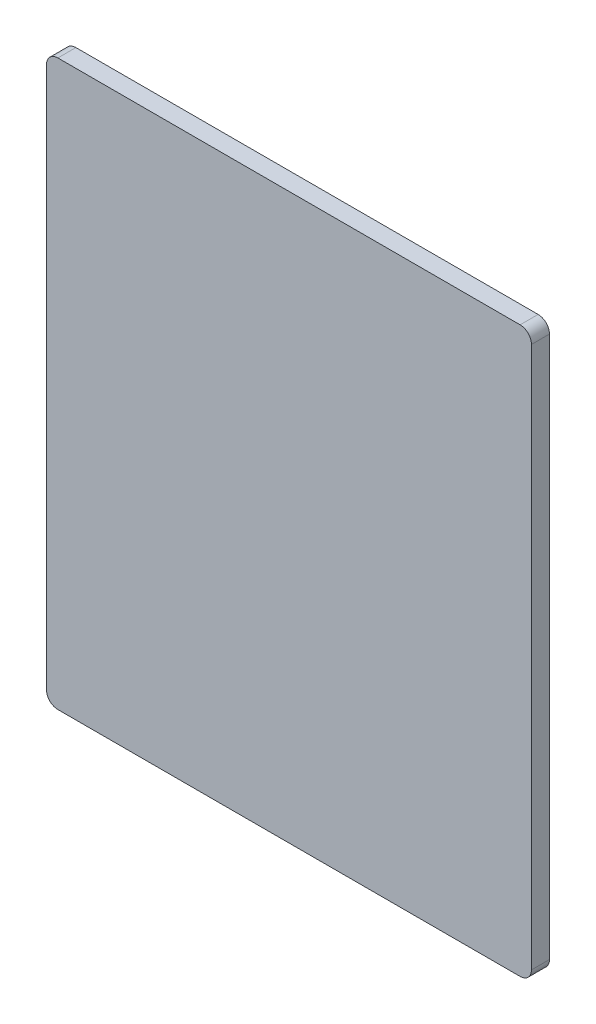
ISO-10303-21;
HEADER;
FILE_DESCRIPTION(('STEP AP214'),'2;1');
FILE_NAME('part.step','',(''),(''),'','','');
FILE_SCHEMA(('AUTOMOTIVE_DESIGN { 1 0 10303 214 1 1 1 1 }'));
ENDSEC;
DATA;
#1=APPLICATION_CONTEXT('core data for automotive mechanical design processes');
#2=APPLICATION_PROTOCOL_DEFINITION('international standard','automotive_design',2000,#1);
#3=PRODUCT_CONTEXT('',#1,'mechanical');
#4=PRODUCT('Part','Part','',(#3));
#5=PRODUCT_RELATED_PRODUCT_CATEGORY('part','',(#4));
#6=PRODUCT_DEFINITION_FORMATION('','',#4);
#7=PRODUCT_DEFINITION_CONTEXT('part definition',#1,'design');
#8=PRODUCT_DEFINITION('design','',#6,#7);
#9=PRODUCT_DEFINITION_SHAPE('','',#8);
#10=(LENGTH_UNIT() NAMED_UNIT(*) SI_UNIT(.MILLI.,.METRE.));
#11=(NAMED_UNIT(*) PLANE_ANGLE_UNIT() SI_UNIT($,.RADIAN.));
#12=(NAMED_UNIT(*) SI_UNIT($,.STERADIAN.) SOLID_ANGLE_UNIT());
#13=UNCERTAINTY_MEASURE_WITH_UNIT(LENGTH_MEASURE(1.E-05),#10,'distance_accuracy_value','');
#14=(GEOMETRIC_REPRESENTATION_CONTEXT(3) GLOBAL_UNCERTAINTY_ASSIGNED_CONTEXT((#13)) GLOBAL_UNIT_ASSIGNED_CONTEXT((#10,
#11,#12)) REPRESENTATION_CONTEXT('',''));
#15=CARTESIAN_POINT('',(0.,0.,0.));
#16=DIRECTION('',(0.,0.,1.));
#17=DIRECTION('',(1.,0.,0.));
#18=AXIS2_PLACEMENT_3D('',#15,#16,#17);
#19=CARTESIAN_POINT('',(40.75,-97.5,3.175));
#20=DIRECTION('',(0.,0.,-1.));
#21=DIRECTION('',(-1.,0.,0.));
#22=AXIS2_PLACEMENT_3D('',#19,#20,#21);
#23=CYLINDRICAL_SURFACE('',#22,1.99999999999999);
#24=CARTESIAN_POINT('',(40.75,-97.5,0.));
#25=DIRECTION('',(0.,0.,1.));
#26=DIRECTION('',(1.,0.,0.));
#27=AXIS2_PLACEMENT_3D('',#24,#25,#26);
#28=CIRCLE('',#27,1.99999999999999);
#29=CARTESIAN_POINT('',(40.75,-99.5,0.));
#30=VERTEX_POINT('',#29);
#31=CARTESIAN_POINT('',(42.75,-97.5,0.));
#32=VERTEX_POINT('',#31);
#33=EDGE_CURVE('E128',#30,#32,#28,.T.);
#34=ORIENTED_EDGE('',*,*,#33,.T.);
#35=DIRECTION('',(0.,0.,-1.));
#36=VECTOR('',#35,1.);
#37=CARTESIAN_POINT('',(42.75,-97.5,3.175));
#38=LINE('',#37,#36);
#39=CARTESIAN_POINT('',(42.75,-97.5,3.175));
#40=VERTEX_POINT('',#39);
#41=EDGE_CURVE('E11',#40,#32,#38,.T.);
#42=ORIENTED_EDGE('',*,*,#41,.F.);
#43=CARTESIAN_POINT('',(40.75,-97.5,3.175));
#44=DIRECTION('',(0.,0.,1.));
#45=DIRECTION('',(1.,0.,0.));
#46=AXIS2_PLACEMENT_3D('',#43,#44,#45);
#47=CIRCLE('',#46,1.99999999999999);
#48=CARTESIAN_POINT('',(40.75,-99.5,3.175));
#49=VERTEX_POINT('',#48);
#50=EDGE_CURVE('E142',#49,#40,#47,.T.);
#51=ORIENTED_EDGE('',*,*,#50,.F.);
#52=DIRECTION('',(0.,0.,-1.));
#53=VECTOR('',#52,1.);
#54=CARTESIAN_POINT('',(40.75,-99.5,3.175));
#55=LINE('',#54,#53);
#56=EDGE_CURVE('E124',#49,#30,#55,.T.);
#57=ORIENTED_EDGE('',*,*,#56,.T.);
#58=EDGE_LOOP('',(#34,#42,#51,#57));
#59=FACE_BOUND('',#58,.T.);
#60=ADVANCED_FACE('F32',(#59),#23,.T.);
#61=CARTESIAN_POINT('',(42.75,-2.,3.175));
#62=DIRECTION('',(-1.,0.,0.));
#63=DIRECTION('',(0.,-1.,0.));
#64=AXIS2_PLACEMENT_3D('',#61,#62,#63);
#65=PLANE('',#64);
#66=DIRECTION('',(0.,1.,0.));
#67=VECTOR('',#66,1.);
#68=CARTESIAN_POINT('',(42.75,-2.,0.));
#69=LINE('',#68,#67);
#70=CARTESIAN_POINT('',(42.75,-2.,0.));
#71=VERTEX_POINT('',#70);
#72=EDGE_CURVE('E131',#32,#71,#69,.T.);
#73=ORIENTED_EDGE('',*,*,#72,.T.);
#74=DIRECTION('',(0.,0.,-1.));
#75=VECTOR('',#74,1.);
#76=CARTESIAN_POINT('',(42.75,-2.,3.175));
#77=LINE('',#76,#75);
#78=CARTESIAN_POINT('',(42.75,-2.,3.175));
#79=VERTEX_POINT('',#78);
#80=EDGE_CURVE('E40',#79,#71,#77,.T.);
#81=ORIENTED_EDGE('',*,*,#80,.F.);
#82=DIRECTION('',(0.,1.,0.));
#83=VECTOR('',#82,1.);
#84=CARTESIAN_POINT('',(42.75,-2.,3.175));
#85=LINE('',#84,#83);
#86=EDGE_CURVE('E91',#40,#79,#85,.T.);
#87=ORIENTED_EDGE('',*,*,#86,.F.);
#88=ORIENTED_EDGE('',*,*,#41,.T.);
#89=EDGE_LOOP('',(#73,#81,#87,#88));
#90=FACE_BOUND('',#89,.T.);
#91=ADVANCED_FACE('F177',(#90),#65,.F.);
#92=CARTESIAN_POINT('',(40.75,-2.,3.175));
#93=DIRECTION('',(0.,0.,-1.));
#94=DIRECTION('',(-1.,0.,0.));
#95=AXIS2_PLACEMENT_3D('',#92,#93,#94);
#96=CYLINDRICAL_SURFACE('',#95,2.);
#97=CARTESIAN_POINT('',(40.75,-2.,0.));
#98=DIRECTION('',(0.,0.,1.));
#99=DIRECTION('',(-1.,0.,0.));
#100=AXIS2_PLACEMENT_3D('',#97,#98,#99);
#101=CIRCLE('',#100,2.);
#102=CARTESIAN_POINT('',(40.75,0.,0.));
#103=VERTEX_POINT('',#102);
#104=EDGE_CURVE('E133',#71,#103,#101,.T.);
#105=ORIENTED_EDGE('',*,*,#104,.T.);
#106=DIRECTION('',(0.,0.,-1.));
#107=VECTOR('',#106,1.);
#108=CARTESIAN_POINT('',(40.75,0.,3.175));
#109=LINE('',#108,#107);
#110=CARTESIAN_POINT('',(40.75,0.,3.175));
#111=VERTEX_POINT('',#110);
#112=EDGE_CURVE('E149',#111,#103,#109,.T.);
#113=ORIENTED_EDGE('',*,*,#112,.F.);
#114=CARTESIAN_POINT('',(40.75,-2.,3.175));
#115=DIRECTION('',(0.,0.,1.));
#116=DIRECTION('',(-1.,0.,0.));
#117=AXIS2_PLACEMENT_3D('',#114,#115,#116);
#118=CIRCLE('',#117,2.);
#119=EDGE_CURVE('E157',#79,#111,#118,.T.);
#120=ORIENTED_EDGE('',*,*,#119,.F.);
#121=ORIENTED_EDGE('',*,*,#80,.T.);
#122=EDGE_LOOP('',(#105,#113,#120,#121));
#123=FACE_BOUND('',#122,.T.);
#124=ADVANCED_FACE('F155',(#123),#96,.T.);
#125=CARTESIAN_POINT('',(-40.75,0.,3.175));
#126=DIRECTION('',(0.,-1.,0.));
#127=DIRECTION('',(0.,0.,-1.));
#128=AXIS2_PLACEMENT_3D('',#125,#126,#127);
#129=PLANE('',#128);
#130=DIRECTION('',(-1.,0.,0.));
#131=VECTOR('',#130,1.);
#132=CARTESIAN_POINT('',(-40.75,0.,0.));
#133=LINE('',#132,#131);
#134=CARTESIAN_POINT('',(-40.75,0.,0.));
#135=VERTEX_POINT('',#134);
#136=EDGE_CURVE('E135',#103,#135,#133,.T.);
#137=ORIENTED_EDGE('',*,*,#136,.T.);
#138=DIRECTION('',(0.,0.,-1.));
#139=VECTOR('',#138,1.);
#140=CARTESIAN_POINT('',(-40.75,0.,3.175));
#141=LINE('',#140,#139);
#142=CARTESIAN_POINT('',(-40.75,0.,3.175));
#143=VERTEX_POINT('',#142);
#144=EDGE_CURVE('E146',#143,#135,#141,.T.);
#145=ORIENTED_EDGE('',*,*,#144,.F.);
#146=DIRECTION('',(-1.,0.,0.));
#147=VECTOR('',#146,1.);
#148=CARTESIAN_POINT('',(-40.75,0.,3.175));
#149=LINE('',#148,#147);
#150=EDGE_CURVE('E169',#111,#143,#149,.T.);
#151=ORIENTED_EDGE('',*,*,#150,.F.);
#152=ORIENTED_EDGE('',*,*,#112,.T.);
#153=EDGE_LOOP('',(#137,#145,#151,#152));
#154=FACE_BOUND('',#153,.T.);
#155=ADVANCED_FACE('F165',(#154),#129,.F.);
#156=CARTESIAN_POINT('',(-40.75,-2.,3.175));
#157=DIRECTION('',(0.,0.,-1.));
#158=DIRECTION('',(-1.,0.,0.));
#159=AXIS2_PLACEMENT_3D('',#156,#157,#158);
#160=CYLINDRICAL_SURFACE('',#159,2.);
#161=CARTESIAN_POINT('',(-40.75,-2.,0.));
#162=DIRECTION('',(0.,0.,1.));
#163=DIRECTION('',(1.,0.,0.));
#164=AXIS2_PLACEMENT_3D('',#161,#162,#163);
#165=CIRCLE('',#164,2.);
#166=CARTESIAN_POINT('',(-42.75,-2.,0.));
#167=VERTEX_POINT('',#166);
#168=EDGE_CURVE('E137',#135,#167,#165,.T.);
#169=ORIENTED_EDGE('',*,*,#168,.T.);
#170=DIRECTION('',(0.,0.,-1.));
#171=VECTOR('',#170,1.);
#172=CARTESIAN_POINT('',(-42.75,-2.,3.175));
#173=LINE('',#172,#171);
#174=CARTESIAN_POINT('',(-42.75,-2.,3.175));
#175=VERTEX_POINT('',#174);
#176=EDGE_CURVE('E119',#175,#167,#173,.T.);
#177=ORIENTED_EDGE('',*,*,#176,.F.);
#178=CARTESIAN_POINT('',(-40.75,-2.,3.175));
#179=DIRECTION('',(0.,0.,1.));
#180=DIRECTION('',(1.,0.,0.));
#181=AXIS2_PLACEMENT_3D('',#178,#179,#180);
#182=CIRCLE('',#181,2.);
#183=EDGE_CURVE('E110',#143,#175,#182,.T.);
#184=ORIENTED_EDGE('',*,*,#183,.F.);
#185=ORIENTED_EDGE('',*,*,#144,.T.);
#186=EDGE_LOOP('',(#169,#177,#184,#185));
#187=FACE_BOUND('',#186,.T.);
#188=ADVANCED_FACE('F168',(#187),#160,.T.);
#189=CARTESIAN_POINT('',(-42.75,-2.,3.175));
#190=DIRECTION('',(1.,0.,0.));
#191=DIRECTION('',(0.,1.,0.));
#192=AXIS2_PLACEMENT_3D('',#189,#190,#191);
#193=PLANE('',#192);
#194=DIRECTION('',(0.,-1.,0.));
#195=VECTOR('',#194,1.);
#196=CARTESIAN_POINT('',(-42.75,-2.,0.));
#197=LINE('',#196,#195);
#198=CARTESIAN_POINT('',(-42.75,-97.5,0.));
#199=VERTEX_POINT('',#198);
#200=EDGE_CURVE('E118',#167,#199,#197,.T.);
#201=ORIENTED_EDGE('',*,*,#200,.T.);
#202=DIRECTION('',(0.,0.,-1.));
#203=VECTOR('',#202,1.);
#204=CARTESIAN_POINT('',(-42.75,-97.5,3.175));
#205=LINE('',#204,#203);
#206=CARTESIAN_POINT('',(-42.75,-97.5,3.175));
#207=VERTEX_POINT('',#206);
#208=EDGE_CURVE('E115',#207,#199,#205,.T.);
#209=ORIENTED_EDGE('',*,*,#208,.F.);
#210=DIRECTION('',(0.,-1.,0.));
#211=VECTOR('',#210,1.);
#212=CARTESIAN_POINT('',(-42.75,-2.,3.175));
#213=LINE('',#212,#211);
#214=EDGE_CURVE('E104',#175,#207,#213,.T.);
#215=ORIENTED_EDGE('',*,*,#214,.F.);
#216=ORIENTED_EDGE('',*,*,#176,.T.);
#217=EDGE_LOOP('',(#201,#209,#215,#216));
#218=FACE_BOUND('',#217,.T.);
#219=ADVANCED_FACE('F116',(#218),#193,.F.);
#220=CARTESIAN_POINT('',(-40.75,-97.5,3.175));
#221=DIRECTION('',(0.,0.,-1.));
#222=DIRECTION('',(-1.,0.,0.));
#223=AXIS2_PLACEMENT_3D('',#220,#221,#222);
#224=CYLINDRICAL_SURFACE('',#223,1.99999999999999);
#225=CARTESIAN_POINT('',(-40.75,-97.5,0.));
#226=DIRECTION('',(0.,0.,1.));
#227=DIRECTION('',(1.,0.,0.));
#228=AXIS2_PLACEMENT_3D('',#225,#226,#227);
#229=CIRCLE('',#228,1.99999999999999);
#230=CARTESIAN_POINT('',(-40.75,-99.5,0.));
#231=VERTEX_POINT('',#230);
#232=EDGE_CURVE('E77',#199,#231,#229,.T.);
#233=ORIENTED_EDGE('',*,*,#232,.T.);
#234=DIRECTION('',(0.,0.,-1.));
#235=VECTOR('',#234,1.);
#236=CARTESIAN_POINT('',(-40.75,-99.5,3.175));
#237=LINE('',#236,#235);
#238=CARTESIAN_POINT('',(-40.75,-99.5,3.175));
#239=VERTEX_POINT('',#238);
#240=EDGE_CURVE('E120',#239,#231,#237,.T.);
#241=ORIENTED_EDGE('',*,*,#240,.F.);
#242=CARTESIAN_POINT('',(-40.75,-97.5,3.175));
#243=DIRECTION('',(0.,0.,1.));
#244=DIRECTION('',(1.,0.,0.));
#245=AXIS2_PLACEMENT_3D('',#242,#243,#244);
#246=CIRCLE('',#245,1.99999999999999);
#247=EDGE_CURVE('E108',#207,#239,#246,.T.);
#248=ORIENTED_EDGE('',*,*,#247,.F.);
#249=ORIENTED_EDGE('',*,*,#208,.T.);
#250=EDGE_LOOP('',(#233,#241,#248,#249));
#251=FACE_BOUND('',#250,.T.);
#252=ADVANCED_FACE('F122',(#251),#224,.T.);
#253=CARTESIAN_POINT('',(-40.75,-99.5,3.175));
#254=DIRECTION('',(0.,1.,0.));
#255=DIRECTION('',(0.,0.,1.));
#256=AXIS2_PLACEMENT_3D('',#253,#254,#255);
#257=PLANE('',#256);
#258=DIRECTION('',(1.,0.,0.));
#259=VECTOR('',#258,1.);
#260=CARTESIAN_POINT('',(-40.75,-99.5,0.));
#261=LINE('',#260,#259);
#262=EDGE_CURVE('E83',#231,#30,#261,.T.);
#263=ORIENTED_EDGE('',*,*,#262,.T.);
#264=ORIENTED_EDGE('',*,*,#56,.F.);
#265=DIRECTION('',(1.,0.,0.));
#266=VECTOR('',#265,1.);
#267=CARTESIAN_POINT('',(-40.75,-99.5,3.175));
#268=LINE('',#267,#266);
#269=EDGE_CURVE('E48',#239,#49,#268,.T.);
#270=ORIENTED_EDGE('',*,*,#269,.F.);
#271=ORIENTED_EDGE('',*,*,#240,.T.);
#272=EDGE_LOOP('',(#263,#264,#270,#271));
#273=FACE_BOUND('',#272,.T.);
#274=ADVANCED_FACE('F193',(#273),#257,.F.);
#275=CARTESIAN_POINT('',(40.75,-97.5,3.175));
#276=DIRECTION('',(0.,0.,1.));
#277=DIRECTION('',(1.,0.,0.));
#278=AXIS2_PLACEMENT_3D('',#275,#276,#277);
#279=PLANE('',#278);
#280=ORIENTED_EDGE('',*,*,#50,.T.);
#281=ORIENTED_EDGE('',*,*,#86,.T.);
#282=ORIENTED_EDGE('',*,*,#119,.T.);
#283=ORIENTED_EDGE('',*,*,#150,.T.);
#284=ORIENTED_EDGE('',*,*,#183,.T.);
#285=ORIENTED_EDGE('',*,*,#214,.T.);
#286=ORIENTED_EDGE('',*,*,#247,.T.);
#287=ORIENTED_EDGE('',*,*,#269,.T.);
#288=EDGE_LOOP('',(#280,#281,#282,#283,#284,#285,#286,#287));
#289=FACE_BOUND('',#288,.T.);
#290=ADVANCED_FACE('F106',(#289),#279,.T.);
#291=CARTESIAN_POINT('',(40.75,-97.5,0.));
#292=DIRECTION('',(0.,0.,1.));
#293=DIRECTION('',(1.,0.,0.));
#294=AXIS2_PLACEMENT_3D('',#291,#292,#293);
#295=PLANE('',#294);
#296=ORIENTED_EDGE('',*,*,#33,.F.);
#297=ORIENTED_EDGE('',*,*,#262,.F.);
#298=ORIENTED_EDGE('',*,*,#232,.F.);
#299=ORIENTED_EDGE('',*,*,#200,.F.);
#300=ORIENTED_EDGE('',*,*,#168,.F.);
#301=ORIENTED_EDGE('',*,*,#136,.F.);
#302=ORIENTED_EDGE('',*,*,#104,.F.);
#303=ORIENTED_EDGE('',*,*,#72,.F.);
#304=EDGE_LOOP('',(#296,#297,#298,#299,#300,#301,#302,#303));
#305=FACE_BOUND('',#304,.T.);
#306=ADVANCED_FACE('F161',(#305),#295,.F.);
#307=CLOSED_SHELL('',(#60,#91,#124,#155,#188,#219,#252,#274,#290,#306));
#308=MANIFOLD_SOLID_BREP('B2',#307);
#309=ADVANCED_BREP_SHAPE_REPRESENTATION('',(#18,#308),#14);
#310=SHAPE_DEFINITION_REPRESENTATION(#9,#309);
ENDSEC;
END-ISO-10303-21;
